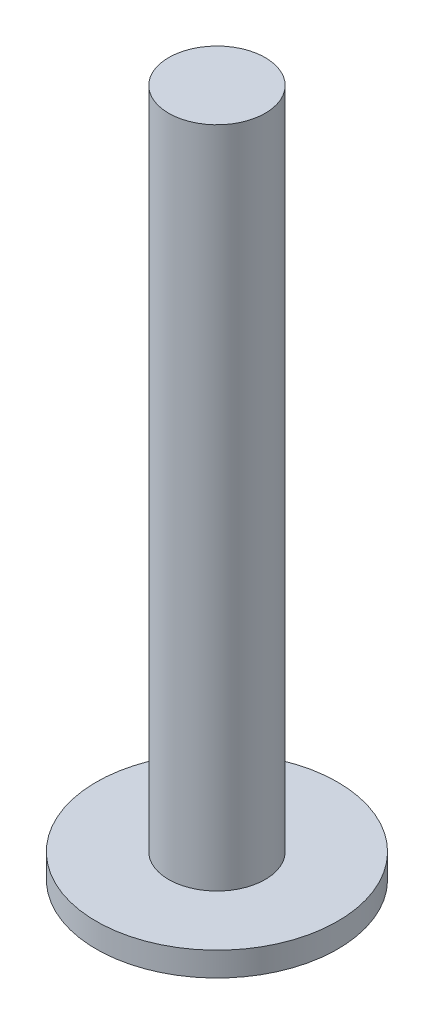
ISO-10303-21;
HEADER;
FILE_DESCRIPTION(('STEP AP214'),'2;1');
FILE_NAME('part.step','',(''),(''),'','','');
FILE_SCHEMA(('AUTOMOTIVE_DESIGN { 1 0 10303 214 1 1 1 1 }'));
ENDSEC;
DATA;
#1=APPLICATION_CONTEXT('core data for automotive mechanical design processes');
#2=APPLICATION_PROTOCOL_DEFINITION('international standard','automotive_design',2000,#1);
#3=PRODUCT_CONTEXT('',#1,'mechanical');
#4=PRODUCT('Part','Part','',(#3));
#5=PRODUCT_RELATED_PRODUCT_CATEGORY('part','',(#4));
#6=PRODUCT_DEFINITION_FORMATION('','',#4);
#7=PRODUCT_DEFINITION_CONTEXT('part definition',#1,'design');
#8=PRODUCT_DEFINITION('design','',#6,#7);
#9=PRODUCT_DEFINITION_SHAPE('','',#8);
#10=(LENGTH_UNIT() NAMED_UNIT(*) SI_UNIT(.MILLI.,.METRE.));
#11=(NAMED_UNIT(*) PLANE_ANGLE_UNIT() SI_UNIT($,.RADIAN.));
#12=(NAMED_UNIT(*) SI_UNIT($,.STERADIAN.) SOLID_ANGLE_UNIT());
#13=UNCERTAINTY_MEASURE_WITH_UNIT(LENGTH_MEASURE(1.E-05),#10,'distance_accuracy_value','');
#14=(GEOMETRIC_REPRESENTATION_CONTEXT(3) GLOBAL_UNCERTAINTY_ASSIGNED_CONTEXT((#13)) GLOBAL_UNIT_ASSIGNED_CONTEXT((#10,
#11,#12)) REPRESENTATION_CONTEXT('',''));
#15=CARTESIAN_POINT('',(0.,0.,0.));
#16=DIRECTION('',(0.,0.,1.));
#17=DIRECTION('',(1.,0.,0.));
#18=AXIS2_PLACEMENT_3D('',#15,#16,#17);
#19=CARTESIAN_POINT('',(0.,-20.,0.));
#20=DIRECTION('',(0.,1.,0.));
#21=DIRECTION('',(0.,0.,1.));
#22=AXIS2_PLACEMENT_3D('',#19,#20,#21);
#23=CYLINDRICAL_SURFACE('',#22,100.);
#24=CARTESIAN_POINT('',(0.,-20.,0.));
#25=DIRECTION('',(0.,-1.,0.));
#26=DIRECTION('',(0.,0.,-1.));
#27=AXIS2_PLACEMENT_3D('',#24,#25,#26);
#28=CIRCLE('',#27,100.);
#29=CARTESIAN_POINT('',(0.,-20.,-100.));
#30=VERTEX_POINT('',#29);
#31=EDGE_CURVE('E11',#30,#30,#28,.T.);
#32=ORIENTED_EDGE('',*,*,#31,.F.);
#33=EDGE_LOOP('',(#32));
#34=FACE_BOUND('',#33,.T.);
#35=CARTESIAN_POINT('',(0.,0.,0.));
#36=DIRECTION('',(0.,-1.,0.));
#37=DIRECTION('',(0.,0.,-1.));
#38=AXIS2_PLACEMENT_3D('',#35,#36,#37);
#39=CIRCLE('',#38,100.);
#40=CARTESIAN_POINT('',(0.,0.,-100.));
#41=VERTEX_POINT('',#40);
#42=EDGE_CURVE('E44',#41,#41,#39,.T.);
#43=ORIENTED_EDGE('',*,*,#42,.T.);
#44=EDGE_LOOP('',(#43));
#45=FACE_BOUND('',#44,.T.);
#46=ADVANCED_FACE('F41',(#34,#45),#23,.T.);
#47=CARTESIAN_POINT('',(0.,-20.,0.));
#48=DIRECTION('',(0.,-1.,0.));
#49=DIRECTION('',(0.,0.,-1.));
#50=AXIS2_PLACEMENT_3D('',#47,#48,#49);
#51=PLANE('',#50);
#52=ORIENTED_EDGE('',*,*,#31,.T.);
#53=EDGE_LOOP('',(#52));
#54=FACE_BOUND('',#53,.T.);
#55=ADVANCED_FACE('F56',(#54),#51,.T.);
#56=CARTESIAN_POINT('',(0.,0.,0.));
#57=DIRECTION('',(0.,-1.,0.));
#58=DIRECTION('',(0.,0.,-1.));
#59=AXIS2_PLACEMENT_3D('',#56,#57,#58);
#60=PLANE('',#59);
#61=ORIENTED_EDGE('',*,*,#42,.F.);
#62=EDGE_LOOP('',(#61));
#63=FACE_BOUND('',#62,.T.);
#64=ADVANCED_FACE('F54',(#63),#60,.F.);
#65=CLOSED_SHELL('',(#46,#55,#64));
#66=MANIFOLD_SOLID_BREP('B2',#65);
#67=CARTESIAN_POINT('',(0.,550.,0.));
#68=DIRECTION('',(0.,-1.,0.));
#69=DIRECTION('',(0.,0.,-1.));
#70=AXIS2_PLACEMENT_3D('',#67,#68,#69);
#71=CYLINDRICAL_SURFACE('',#70,40.);
#72=CARTESIAN_POINT('',(0.,550.,0.));
#73=DIRECTION('',(0.,1.,0.));
#74=DIRECTION('',(0.,0.,1.));
#75=AXIS2_PLACEMENT_3D('',#72,#73,#74);
#76=CIRCLE('',#75,40.);
#77=CARTESIAN_POINT('',(0.,550.,40.));
#78=VERTEX_POINT('',#77);
#79=EDGE_CURVE('E40',#78,#78,#76,.T.);
#80=ORIENTED_EDGE('',*,*,#79,.F.);
#81=EDGE_LOOP('',(#80));
#82=FACE_BOUND('',#81,.T.);
#83=CARTESIAN_POINT('',(0.,0.,0.));
#84=DIRECTION('',(0.,1.,0.));
#85=DIRECTION('',(0.,0.,1.));
#86=AXIS2_PLACEMENT_3D('',#83,#84,#85);
#87=CIRCLE('',#86,40.);
#88=CARTESIAN_POINT('',(0.,0.,40.));
#89=VERTEX_POINT('',#88);
#90=EDGE_CURVE('E85',#89,#89,#87,.T.);
#91=ORIENTED_EDGE('',*,*,#90,.T.);
#92=EDGE_LOOP('',(#91));
#93=FACE_BOUND('',#92,.T.);
#94=ADVANCED_FACE('F82',(#82,#93),#71,.T.);
#95=CARTESIAN_POINT('',(0.,550.,0.));
#96=DIRECTION('',(0.,1.,0.));
#97=DIRECTION('',(0.,0.,1.));
#98=AXIS2_PLACEMENT_3D('',#95,#96,#97);
#99=PLANE('',#98);
#100=ORIENTED_EDGE('',*,*,#79,.T.);
#101=EDGE_LOOP('',(#100));
#102=FACE_BOUND('',#101,.T.);
#103=ADVANCED_FACE('F97',(#102),#99,.T.);
#104=CARTESIAN_POINT('',(0.,0.,0.));
#105=DIRECTION('',(0.,1.,0.));
#106=DIRECTION('',(0.,0.,1.));
#107=AXIS2_PLACEMENT_3D('',#104,#105,#106);
#108=PLANE('',#107);
#109=ORIENTED_EDGE('',*,*,#90,.F.);
#110=EDGE_LOOP('',(#109));
#111=FACE_BOUND('',#110,.T.);
#112=ADVANCED_FACE('F95',(#111),#108,.F.);
#113=CLOSED_SHELL('',(#94,#103,#112));
#114=MANIFOLD_SOLID_BREP('B6',#113);
#115=ADVANCED_BREP_SHAPE_REPRESENTATION('',(#18,#66,#114),#14);
#116=SHAPE_DEFINITION_REPRESENTATION(#9,#115);
ENDSEC;
END-ISO-10303-21;
